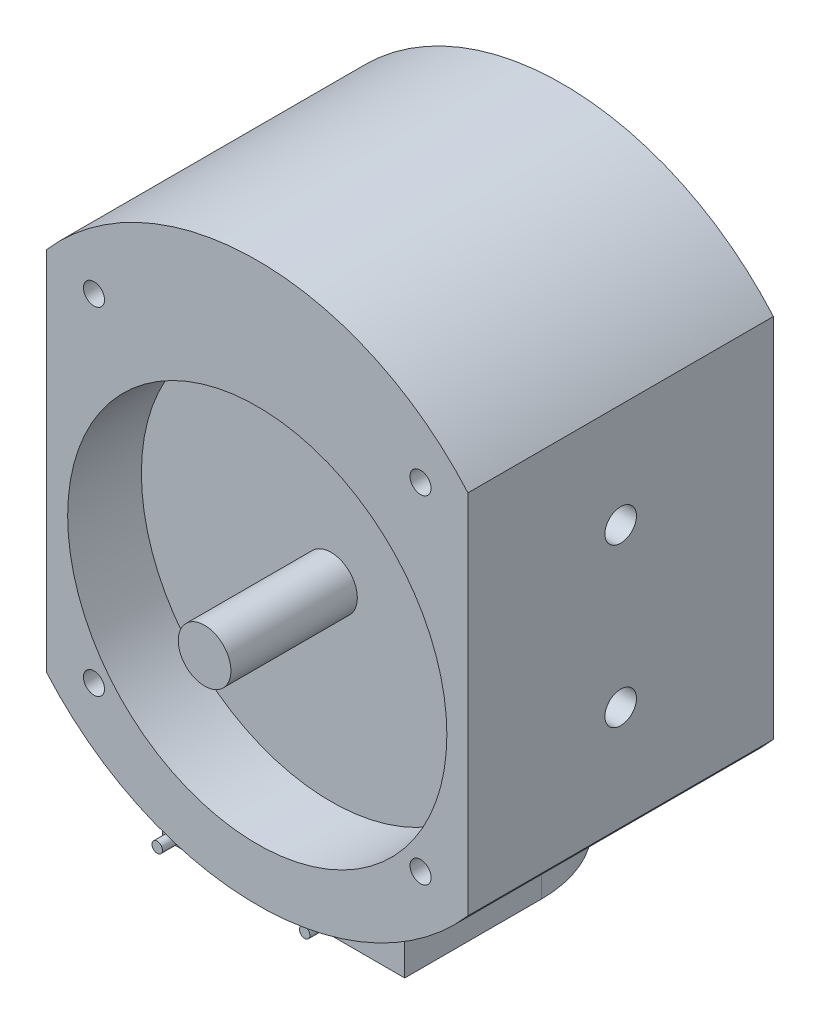
ISO-10303-21;
HEADER;
FILE_DESCRIPTION(('STEP AP214'),'2;1');
FILE_NAME('part.step','',(''),(''),'','','');
FILE_SCHEMA(('AUTOMOTIVE_DESIGN { 1 0 10303 214 1 1 1 1 }'));
ENDSEC;
DATA;
#1=APPLICATION_CONTEXT('core data for automotive mechanical design processes');
#2=APPLICATION_PROTOCOL_DEFINITION('international standard','automotive_design',2000,#1);
#3=PRODUCT_CONTEXT('',#1,'mechanical');
#4=PRODUCT('Part','Part','',(#3));
#5=PRODUCT_RELATED_PRODUCT_CATEGORY('part','',(#4));
#6=PRODUCT_DEFINITION_FORMATION('','',#4);
#7=PRODUCT_DEFINITION_CONTEXT('part definition',#1,'design');
#8=PRODUCT_DEFINITION('design','',#6,#7);
#9=PRODUCT_DEFINITION_SHAPE('','',#8);
#10=(LENGTH_UNIT() NAMED_UNIT(*) SI_UNIT(.MILLI.,.METRE.));
#11=(NAMED_UNIT(*) PLANE_ANGLE_UNIT() SI_UNIT($,.RADIAN.));
#12=(NAMED_UNIT(*) SI_UNIT($,.STERADIAN.) SOLID_ANGLE_UNIT());
#13=UNCERTAINTY_MEASURE_WITH_UNIT(LENGTH_MEASURE(1.E-05),#10,'distance_accuracy_value','');
#14=(GEOMETRIC_REPRESENTATION_CONTEXT(3) GLOBAL_UNCERTAINTY_ASSIGNED_CONTEXT((#13)) GLOBAL_UNIT_ASSIGNED_CONTEXT((#10,
#11,#12)) REPRESENTATION_CONTEXT('',''));
#15=CARTESIAN_POINT('',(0.,0.,0.));
#16=DIRECTION('',(0.,0.,1.));
#17=DIRECTION('',(1.,0.,0.));
#18=AXIS2_PLACEMENT_3D('',#15,#16,#17);
#19=CARTESIAN_POINT('',(0.,3.5,14.5));
#20=DIRECTION('',(0.,0.,-1.));
#21=DIRECTION('',(-1.,0.,0.));
#22=AXIS2_PLACEMENT_3D('',#19,#20,#21);
#23=CYLINDRICAL_SURFACE('',#22,26.5);
#24=CARTESIAN_POINT('',(-11.6589105316382,-20.2974747655136,-14.5));
#25=CARTESIAN_POINT('',(-11.9154676968057,-20.1718093041742,-14.2959001140857));
#26=CARTESIAN_POINT('',(-12.1630824303505,-20.0453255149593,-14.0810500499836));
#27=CARTESIAN_POINT('',(-12.6393824185313,-19.7930960766859,-13.6306854927107));
#28=CARTESIAN_POINT('',(-12.8680595138203,-19.6673507672593,-13.3951621814991));
#29=CARTESIAN_POINT('',(-13.3077324666989,-19.4176568230004,-12.9016408628952));
#30=CARTESIAN_POINT('',(-13.5184946313567,-19.2937455034853,-12.6434154580998));
#31=CARTESIAN_POINT('',(-13.9179940224215,-19.052027070936,-12.1077985291482));
#32=CARTESIAN_POINT('',(-14.106733705845,-18.9342192777571,-11.8304091485976));
#33=CARTESIAN_POINT('',(-14.4614925275649,-18.7072015210682,-11.2561339579276));
#34=CARTESIAN_POINT('',(-14.6274044286773,-18.5980330973372,-10.959165215517));
#35=CARTESIAN_POINT('',(-14.9337280022662,-18.3921868317732,-10.3481056723228));
#36=CARTESIAN_POINT('',(-15.0741359058972,-18.2955108366133,-10.0340123498616));
#37=CARTESIAN_POINT('',(-15.3265715966753,-18.1187377910747,-9.39271446062139));
#38=CARTESIAN_POINT('',(-15.4387875199959,-18.0385315263143,-9.06561465503932));
#39=CARTESIAN_POINT('',(-15.6340136706589,-17.8972464012562,-8.39901585498673));
#40=CARTESIAN_POINT('',(-15.7170436546997,-17.836154604983,-8.05952542054373));
#41=CARTESIAN_POINT('',(-15.8555328161024,-17.733464191094,-7.35398527624147));
#42=CARTESIAN_POINT('',(-15.9094185099119,-17.6929839471289,-6.98745376667842));
#43=CARTESIAN_POINT('',(-15.9636160456416,-17.6521491683226,-6.43290899781161));
#44=CARTESIAN_POINT('',(-15.977243832489,-17.6418512079414,-6.24680341666563));
#45=CARTESIAN_POINT('',(-15.9954402546632,-17.6280845885084,-5.87381509301593));
#46=CARTESIAN_POINT('',(-16.0000048207019,-17.6246189971213,-5.68693203915432));
#47=CARTESIAN_POINT('',(-16.,-17.6246301742776,-5.5));
#48=B_SPLINE_CURVE_WITH_KNOTS('',3,(#24,#25,#26,#27,#28,#29,#30,#31,#32,#33,#34,#35,#36,#37,#38,
#39,#40,#41,#42,#43,#44,#45,#46,#47),.UNSPECIFIED.,.F.,.F.,(4,2,2,2,2,2,2,2,2,2,2,4),(0.,
1.05303057629743,2.10651251923715,3.1721148381744,4.2375981554882,5.30792729946527,
6.37841448255864,7.44155585280831,8.50397616363341,9.61914308940885,10.1795044776233,
10.7401174051968),.UNSPECIFIED.);
#49=CARTESIAN_POINT('',(-11.6589105316382,-20.2974747655136,-14.5));
#50=VERTEX_POINT('',#49);
#51=CARTESIAN_POINT('',(-16.,-17.6246301742776,-5.5));
#52=VERTEX_POINT('',#51);
#53=EDGE_CURVE('E55',#50,#52,#48,.T.);
#54=ORIENTED_EDGE('',*,*,#53,.T.);
#55=DIRECTION('',(0.,0.,-1.));
#56=VECTOR('',#55,1.);
#57=CARTESIAN_POINT('',(-16.,-17.6246301742776,14.5));
#58=LINE('',#57,#56);
#59=CARTESIAN_POINT('',(-16.,-17.6246301742776,7.5));
#60=VERTEX_POINT('',#59);
#61=EDGE_CURVE('E59',#52,#60,#58,.F.);
#62=ORIENTED_EDGE('',*,*,#61,.T.);
#63=CARTESIAN_POINT('',(0.,3.5,7.5));
#64=DIRECTION('',(0.,0.,-1.));
#65=DIRECTION('',(-1.,0.,0.));
#66=AXIS2_PLACEMENT_3D('',#63,#64,#65);
#67=CIRCLE('',#66,26.5);
#68=CARTESIAN_POINT('',(7.,-22.0587558382641,7.5));
#69=VERTEX_POINT('',#68);
#70=EDGE_CURVE('E302',#60,#69,#67,.F.);
#71=ORIENTED_EDGE('',*,*,#70,.T.);
#72=DIRECTION('',(0.,0.,-1.));
#73=VECTOR('',#72,1.);
#74=CARTESIAN_POINT('',(7.,-22.0587558382641,14.5));
#75=LINE('',#74,#73);
#76=CARTESIAN_POINT('',(7.,-22.0587558382641,-5.5));
#77=VERTEX_POINT('',#76);
#78=EDGE_CURVE('E131',#69,#77,#75,.T.);
#79=ORIENTED_EDGE('',*,*,#78,.T.);
#80=CARTESIAN_POINT('',(7.,-22.0587558382641,-5.5));
#81=CARTESIAN_POINT('',(7.00004114539061,-22.0586982959201,-5.81855562818553));
#82=CARTESIAN_POINT('',(6.9867656500787,-22.0623791193772,-6.1370944323245));
#83=CARTESIAN_POINT('',(6.93388648216325,-22.0767980733885,-6.77175494429095));
#84=CARTESIAN_POINT('',(6.89428823810782,-22.0875347488071,-7.08787713690297));
#85=CARTESIAN_POINT('',(6.78917468691193,-22.1156179189392,-7.71482056973197));
#86=CARTESIAN_POINT('',(6.72371187861413,-22.1329510218861,-8.02565122562203));
#87=CARTESIAN_POINT('',(6.56742900996726,-22.1734381899362,-8.64047954285085));
#88=CARTESIAN_POINT('',(6.47660866814574,-22.1965923196534,-8.94447712830102));
#89=CARTESIAN_POINT('',(6.27033801334873,-22.2477013416021,-9.54353395824915));
#90=CARTESIAN_POINT('',(6.154890705678,-22.275655647972,-9.83859428837513));
#91=CARTESIAN_POINT('',(5.90021406441555,-22.3351421466902,-10.4178933349847));
#92=CARTESIAN_POINT('',(5.76098388630366,-22.3666744660788,-10.7021316667451));
#93=CARTESIAN_POINT('',(5.45972162719824,-22.4319333124048,-11.2579353289227));
#94=CARTESIAN_POINT('',(5.29769379265164,-22.4656594300827,-11.5295030069466));
#95=CARTESIAN_POINT('',(4.95195493451766,-22.5338088457176,-12.0582300635503));
#96=CARTESIAN_POINT('',(4.76824796286989,-22.5682320123994,-12.3153921214044));
#97=CARTESIAN_POINT('',(4.29491358302745,-22.6511753514429,-12.9233316042166));
#98=CARTESIAN_POINT('',(3.99418204469064,-22.6992527365189,-13.265667729756));
#99=CARTESIAN_POINT('',(3.51431437372429,-22.7664365608697,-13.7506090767723));
#100=CARTESIAN_POINT('',(3.34962448663423,-22.7880026119282,-13.9074470957732));
#101=CARTESIAN_POINT('',(3.01104568685911,-22.828932636612,-14.2112506292072));
#102=CARTESIAN_POINT('',(2.83715452285705,-22.8482960676281,-14.3582137073428));
#103=CARTESIAN_POINT('',(2.65891053163819,-22.866270020326,-14.5));
#104=B_SPLINE_CURVE_WITH_KNOTS('',3,(#80,#81,#82,#83,#84,#85,#86,#87,#88,#89,#90,#91,#92,#93,
#94,#95,#96,#97,#98,#99,#100,#101,#102,#103),.UNSPECIFIED.,.F.,.F.,(4,2,2,2,2,2,2,2,2,2,2,4),
(0.,0.955343151114599,1.91048934263225,2.86370669564004,3.81693462992461,4.77004630533584,
5.72319183239708,6.67616005452972,7.6289504433775,8.99985656948546,9.68484258606795,
10.3699969832328),.UNSPECIFIED.);
#105=CARTESIAN_POINT('',(2.65891053163817,-22.866270020326,-14.5));
#106=VERTEX_POINT('',#105);
#107=EDGE_CURVE('E129',#77,#106,#104,.T.);
#108=ORIENTED_EDGE('',*,*,#107,.T.);
#109=CARTESIAN_POINT('',(0.,3.5,-14.5));
#110=DIRECTION('',(0.,0.,1.));
#111=DIRECTION('',(1.,0.,0.));
#112=AXIS2_PLACEMENT_3D('',#109,#110,#111);
#113=CIRCLE('',#112,26.5);
#114=CARTESIAN_POINT('',(20.,-13.8853386507137,-14.5));
#115=VERTEX_POINT('',#114);
#116=EDGE_CURVE('E114',#106,#115,#113,.T.);
#117=ORIENTED_EDGE('',*,*,#116,.T.);
#118=DIRECTION('',(0.,0.,-1.));
#119=VECTOR('',#118,1.);
#120=CARTESIAN_POINT('',(20.,-13.8853386507137,14.5));
#121=LINE('',#120,#119);
#122=CARTESIAN_POINT('',(20.,-13.8853386507137,14.5));
#123=VERTEX_POINT('',#122);
#124=EDGE_CURVE('E227',#123,#115,#121,.T.);
#125=ORIENTED_EDGE('',*,*,#124,.F.);
#126=CARTESIAN_POINT('',(0.,3.5,14.5));
#127=DIRECTION('',(0.,0.,1.));
#128=DIRECTION('',(1.,0.,0.));
#129=AXIS2_PLACEMENT_3D('',#126,#127,#128);
#130=CIRCLE('',#129,26.5);
#131=CARTESIAN_POINT('',(-20.,-13.8853386507137,14.5));
#132=VERTEX_POINT('',#131);
#133=EDGE_CURVE('E226',#132,#123,#130,.T.);
#134=ORIENTED_EDGE('',*,*,#133,.F.);
#135=DIRECTION('',(0.,0.,-1.));
#136=VECTOR('',#135,1.);
#137=CARTESIAN_POINT('',(-20.,-13.8853386507137,14.5));
#138=LINE('',#137,#136);
#139=CARTESIAN_POINT('',(-20.,-13.8853386507137,-14.5));
#140=VERTEX_POINT('',#139);
#141=EDGE_CURVE('E218',#132,#140,#138,.T.);
#142=ORIENTED_EDGE('',*,*,#141,.T.);
#143=EDGE_CURVE('E125',#140,#50,#113,.T.);
#144=ORIENTED_EDGE('',*,*,#143,.T.);
#145=EDGE_LOOP('',(#54,#62,#71,#79,#108,#117,#125,#134,#142,#144));
#146=FACE_BOUND('',#145,.T.);
#147=ADVANCED_FACE('F38',(#146),#23,.T.);
#148=CARTESIAN_POINT('',(0.,3.5,14.5));
#149=DIRECTION('',(0.,0.,-1.));
#150=DIRECTION('',(-1.,0.,0.));
#151=AXIS2_PLACEMENT_3D('',#148,#149,#150);
#152=CYLINDRICAL_SURFACE('',#151,26.5);
#153=CARTESIAN_POINT('',(0.,3.5,-14.5));
#154=DIRECTION('',(0.,0.,1.));
#155=DIRECTION('',(1.,0.,0.));
#156=AXIS2_PLACEMENT_3D('',#153,#154,#155);
#157=CIRCLE('',#156,26.5);
#158=CARTESIAN_POINT('',(20.,20.8853386507137,-14.5));
#159=VERTEX_POINT('',#158);
#160=CARTESIAN_POINT('',(-20.,20.8853386507137,-14.5));
#161=VERTEX_POINT('',#160);
#162=EDGE_CURVE('E224',#159,#161,#157,.T.);
#163=ORIENTED_EDGE('',*,*,#162,.T.);
#164=DIRECTION('',(0.,0.,-1.));
#165=VECTOR('',#164,1.);
#166=CARTESIAN_POINT('',(-20.,20.8853386507137,14.5));
#167=LINE('',#166,#165);
#168=CARTESIAN_POINT('',(-20.,20.8853386507137,14.5));
#169=VERTEX_POINT('',#168);
#170=EDGE_CURVE('E221',#169,#161,#167,.T.);
#171=ORIENTED_EDGE('',*,*,#170,.F.);
#172=CARTESIAN_POINT('',(0.,3.5,14.5));
#173=DIRECTION('',(0.,0.,1.));
#174=DIRECTION('',(1.,0.,0.));
#175=AXIS2_PLACEMENT_3D('',#172,#173,#174);
#176=CIRCLE('',#175,26.5);
#177=CARTESIAN_POINT('',(20.,20.8853386507137,14.5));
#178=VERTEX_POINT('',#177);
#179=EDGE_CURVE('E230',#178,#169,#176,.T.);
#180=ORIENTED_EDGE('',*,*,#179,.F.);
#181=DIRECTION('',(0.,0.,-1.));
#182=VECTOR('',#181,1.);
#183=CARTESIAN_POINT('',(20.,20.8853386507137,14.5));
#184=LINE('',#183,#182);
#185=EDGE_CURVE('E234',#178,#159,#184,.T.);
#186=ORIENTED_EDGE('',*,*,#185,.T.);
#187=EDGE_LOOP('',(#163,#171,#180,#186));
#188=FACE_BOUND('',#187,.T.);
#189=ADVANCED_FACE('F40',(#188),#152,.T.);
#190=CARTESIAN_POINT('',(-20.,20.8853386507137,14.5));
#191=DIRECTION('',(1.,0.,0.));
#192=DIRECTION('',(0.,1.,0.));
#193=AXIS2_PLACEMENT_3D('',#190,#191,#192);
#194=PLANE('',#193);
#195=CARTESIAN_POINT('',(-20.,11.,0.));
#196=DIRECTION('',(1.,0.,0.));
#197=DIRECTION('',(0.,1.,0.));
#198=AXIS2_PLACEMENT_3D('',#195,#196,#197);
#199=CIRCLE('',#198,1.5);
#200=CARTESIAN_POINT('',(-20.,12.5,0.));
#201=VERTEX_POINT('',#200);
#202=EDGE_CURVE('E210',#201,#201,#199,.T.);
#203=ORIENTED_EDGE('',*,*,#202,.T.);
#204=EDGE_LOOP('',(#203));
#205=FACE_BOUND('',#204,.T.);
#206=CARTESIAN_POINT('',(-20.,-3.99999999999999,0.));
#207=DIRECTION('',(1.,0.,0.));
#208=DIRECTION('',(0.,1.,0.));
#209=AXIS2_PLACEMENT_3D('',#206,#207,#208);
#210=CIRCLE('',#209,1.5);
#211=CARTESIAN_POINT('',(-20.,-2.49999999999999,0.));
#212=VERTEX_POINT('',#211);
#213=EDGE_CURVE('E214',#212,#212,#210,.T.);
#214=ORIENTED_EDGE('',*,*,#213,.T.);
#215=EDGE_LOOP('',(#214));
#216=FACE_BOUND('',#215,.T.);
#217=DIRECTION('',(0.,-1.,0.));
#218=VECTOR('',#217,1.);
#219=CARTESIAN_POINT('',(-20.,20.8853386507137,-14.5));
#220=LINE('',#219,#218);
#221=EDGE_CURVE('E126',#161,#140,#220,.T.);
#222=ORIENTED_EDGE('',*,*,#221,.T.);
#223=ORIENTED_EDGE('',*,*,#141,.F.);
#224=DIRECTION('',(0.,-1.,0.));
#225=VECTOR('',#224,1.);
#226=CARTESIAN_POINT('',(-20.,20.8853386507137,14.5));
#227=LINE('',#226,#225);
#228=EDGE_CURVE('E308',#169,#132,#227,.T.);
#229=ORIENTED_EDGE('',*,*,#228,.F.);
#230=ORIENTED_EDGE('',*,*,#170,.T.);
#231=EDGE_LOOP('',(#222,#223,#229,#230));
#232=FACE_BOUND('',#231,.T.);
#233=ADVANCED_FACE('F195',(#205,#216,#232),#194,.F.);
#234=CARTESIAN_POINT('',(20.,20.8853386507137,14.5));
#235=DIRECTION('',(-1.,0.,0.));
#236=DIRECTION('',(0.,-1.,0.));
#237=AXIS2_PLACEMENT_3D('',#234,#235,#236);
#238=PLANE('',#237);
#239=CARTESIAN_POINT('',(20.,11.,0.));
#240=DIRECTION('',(1.,0.,0.));
#241=DIRECTION('',(0.,1.,0.));
#242=AXIS2_PLACEMENT_3D('',#239,#240,#241);
#243=CIRCLE('',#242,1.5);
#244=CARTESIAN_POINT('',(20.,12.5,0.));
#245=VERTEX_POINT('',#244);
#246=EDGE_CURVE('E443',#245,#245,#243,.T.);
#247=ORIENTED_EDGE('',*,*,#246,.F.);
#248=EDGE_LOOP('',(#247));
#249=FACE_BOUND('',#248,.T.);
#250=CARTESIAN_POINT('',(20.,-3.99999999999999,0.));
#251=DIRECTION('',(1.,0.,0.));
#252=DIRECTION('',(0.,1.,0.));
#253=AXIS2_PLACEMENT_3D('',#250,#251,#252);
#254=CIRCLE('',#253,1.5);
#255=CARTESIAN_POINT('',(20.,-2.49999999999999,0.));
#256=VERTEX_POINT('',#255);
#257=EDGE_CURVE('E428',#256,#256,#254,.T.);
#258=ORIENTED_EDGE('',*,*,#257,.F.);
#259=EDGE_LOOP('',(#258));
#260=FACE_BOUND('',#259,.T.);
#261=DIRECTION('',(0.,1.,0.));
#262=VECTOR('',#261,1.);
#263=CARTESIAN_POINT('',(20.,20.8853386507137,-14.5));
#264=LINE('',#263,#262);
#265=EDGE_CURVE('E122',#115,#159,#264,.T.);
#266=ORIENTED_EDGE('',*,*,#265,.T.);
#267=ORIENTED_EDGE('',*,*,#185,.F.);
#268=DIRECTION('',(0.,1.,0.));
#269=VECTOR('',#268,1.);
#270=CARTESIAN_POINT('',(20.,20.8853386507137,14.5));
#271=LINE('',#270,#269);
#272=EDGE_CURVE('E237',#123,#178,#271,.T.);
#273=ORIENTED_EDGE('',*,*,#272,.F.);
#274=ORIENTED_EDGE('',*,*,#124,.T.);
#275=EDGE_LOOP('',(#266,#267,#273,#274));
#276=FACE_BOUND('',#275,.T.);
#277=ADVANCED_FACE('F198',(#249,#260,#276),#238,.F.);
#278=CARTESIAN_POINT('',(0.,3.5,14.5));
#279=DIRECTION('',(0.,0.,1.));
#280=DIRECTION('',(1.,0.,0.));
#281=AXIS2_PLACEMENT_3D('',#278,#279,#280);
#282=PLANE('',#281);
#283=CARTESIAN_POINT('',(-15.5,-12.5,14.5));
#284=DIRECTION('',(0.,0.,1.));
#285=DIRECTION('',(-1.,0.,0.));
#286=AXIS2_PLACEMENT_3D('',#283,#284,#285);
#287=CIRCLE('',#286,1.);
#288=CARTESIAN_POINT('',(-16.5,-12.5,14.5));
#289=VERTEX_POINT('',#288);
#290=EDGE_CURVE('E442',#289,#289,#287,.T.);
#291=ORIENTED_EDGE('',*,*,#290,.F.);
#292=EDGE_LOOP('',(#291));
#293=FACE_BOUND('',#292,.T.);
#294=CARTESIAN_POINT('',(15.5,-12.5,14.5));
#295=DIRECTION('',(0.,0.,1.));
#296=DIRECTION('',(1.,0.,0.));
#297=AXIS2_PLACEMENT_3D('',#294,#295,#296);
#298=CIRCLE('',#297,1.);
#299=CARTESIAN_POINT('',(16.5,-12.5,14.5));
#300=VERTEX_POINT('',#299);
#301=EDGE_CURVE('E451',#300,#300,#298,.T.);
#302=ORIENTED_EDGE('',*,*,#301,.F.);
#303=EDGE_LOOP('',(#302));
#304=FACE_BOUND('',#303,.T.);
#305=CARTESIAN_POINT('',(15.5,19.5,14.5));
#306=DIRECTION('',(0.,0.,1.));
#307=DIRECTION('',(-1.,0.,0.));
#308=AXIS2_PLACEMENT_3D('',#305,#306,#307);
#309=CIRCLE('',#308,1.);
#310=CARTESIAN_POINT('',(14.5,19.5,14.5));
#311=VERTEX_POINT('',#310);
#312=EDGE_CURVE('E448',#311,#311,#309,.T.);
#313=ORIENTED_EDGE('',*,*,#312,.F.);
#314=EDGE_LOOP('',(#313));
#315=FACE_BOUND('',#314,.T.);
#316=CARTESIAN_POINT('',(-15.5,19.5,14.5));
#317=DIRECTION('',(0.,0.,1.));
#318=DIRECTION('',(1.,0.,0.));
#319=AXIS2_PLACEMENT_3D('',#316,#317,#318);
#320=CIRCLE('',#319,1.);
#321=CARTESIAN_POINT('',(-14.5,19.5,14.5));
#322=VERTEX_POINT('',#321);
#323=EDGE_CURVE('E249',#322,#322,#320,.T.);
#324=ORIENTED_EDGE('',*,*,#323,.F.);
#325=EDGE_LOOP('',(#324));
#326=FACE_BOUND('',#325,.T.);
#327=CARTESIAN_POINT('',(0.,0.,14.5));
#328=DIRECTION('',(0.,0.,1.));
#329=DIRECTION('',(1.,0.,0.));
#330=AXIS2_PLACEMENT_3D('',#327,#328,#329);
#331=CIRCLE('',#330,18.);
#332=CARTESIAN_POINT('',(18.,0.,14.5));
#333=VERTEX_POINT('',#332);
#334=EDGE_CURVE('E260',#333,#333,#331,.T.);
#335=ORIENTED_EDGE('',*,*,#334,.F.);
#336=EDGE_LOOP('',(#335));
#337=FACE_BOUND('',#336,.T.);
#338=ORIENTED_EDGE('',*,*,#179,.T.);
#339=ORIENTED_EDGE('',*,*,#228,.T.);
#340=ORIENTED_EDGE('',*,*,#133,.T.);
#341=ORIENTED_EDGE('',*,*,#272,.T.);
#342=EDGE_LOOP('',(#338,#339,#340,#341));
#343=FACE_BOUND('',#342,.T.);
#344=ADVANCED_FACE('F205',(#293,#304,#315,#326,#337,#343),#282,.T.);
#345=CARTESIAN_POINT('',(0.,3.5,-14.5));
#346=DIRECTION('',(0.,0.,1.));
#347=DIRECTION('',(1.,0.,0.));
#348=AXIS2_PLACEMENT_3D('',#345,#346,#347);
#349=PLANE('',#348);
#350=CARTESIAN_POINT('',(-15.5,-12.5,-14.5));
#351=DIRECTION('',(0.,0.,1.));
#352=DIRECTION('',(1.,0.,0.));
#353=AXIS2_PLACEMENT_3D('',#350,#351,#352);
#354=CIRCLE('',#353,1.);
#355=CARTESIAN_POINT('',(-14.5,-12.5,-14.5));
#356=VERTEX_POINT('',#355);
#357=EDGE_CURVE('E42',#356,#356,#354,.T.);
#358=ORIENTED_EDGE('',*,*,#357,.T.);
#359=EDGE_LOOP('',(#358));
#360=FACE_BOUND('',#359,.T.);
#361=CARTESIAN_POINT('',(15.5,-12.5,-14.5));
#362=DIRECTION('',(0.,0.,1.));
#363=DIRECTION('',(1.,0.,0.));
#364=AXIS2_PLACEMENT_3D('',#361,#362,#363);
#365=CIRCLE('',#364,1.);
#366=CARTESIAN_POINT('',(16.5,-12.5,-14.5));
#367=VERTEX_POINT('',#366);
#368=EDGE_CURVE('E251',#367,#367,#365,.T.);
#369=ORIENTED_EDGE('',*,*,#368,.T.);
#370=EDGE_LOOP('',(#369));
#371=FACE_BOUND('',#370,.T.);
#372=CARTESIAN_POINT('',(15.5,19.5,-14.5));
#373=DIRECTION('',(0.,0.,1.));
#374=DIRECTION('',(1.,0.,0.));
#375=AXIS2_PLACEMENT_3D('',#372,#373,#374);
#376=CIRCLE('',#375,1.);
#377=CARTESIAN_POINT('',(16.5,19.5,-14.5));
#378=VERTEX_POINT('',#377);
#379=EDGE_CURVE('E248',#378,#378,#376,.T.);
#380=ORIENTED_EDGE('',*,*,#379,.T.);
#381=EDGE_LOOP('',(#380));
#382=FACE_BOUND('',#381,.T.);
#383=CARTESIAN_POINT('',(-15.5,19.5,-14.5));
#384=DIRECTION('',(0.,0.,1.));
#385=DIRECTION('',(1.,0.,0.));
#386=AXIS2_PLACEMENT_3D('',#383,#384,#385);
#387=CIRCLE('',#386,1.);
#388=CARTESIAN_POINT('',(-14.5,19.5,-14.5));
#389=VERTEX_POINT('',#388);
#390=EDGE_CURVE('E245',#389,#389,#387,.T.);
#391=ORIENTED_EDGE('',*,*,#390,.T.);
#392=EDGE_LOOP('',(#391));
#393=FACE_BOUND('',#392,.T.);
#394=CARTESIAN_POINT('',(0.,0.,-14.5));
#395=DIRECTION('',(0.,0.,1.));
#396=DIRECTION('',(1.,0.,0.));
#397=AXIS2_PLACEMENT_3D('',#394,#395,#396);
#398=CIRCLE('',#397,2.5);
#399=CARTESIAN_POINT('',(2.5,0.,-14.5));
#400=VERTEX_POINT('',#399);
#401=EDGE_CURVE('E11',#400,#400,#398,.F.);
#402=ORIENTED_EDGE('',*,*,#401,.F.);
#403=EDGE_LOOP('',(#402));
#404=FACE_BOUND('',#403,.T.);
#405=ORIENTED_EDGE('',*,*,#162,.F.);
#406=ORIENTED_EDGE('',*,*,#265,.F.);
#407=ORIENTED_EDGE('',*,*,#116,.F.);
#408=DIRECTION('',(0.,-1.,0.));
#409=VECTOR('',#408,1.);
#410=CARTESIAN_POINT('',(2.65891053163817,30.002,-14.5));
#411=LINE('',#410,#409);
#412=CARTESIAN_POINT('',(2.65891053163817,-29.,-14.5));
#413=VERTEX_POINT('',#412);
#414=EDGE_CURVE('E120',#106,#413,#411,.T.);
#415=ORIENTED_EDGE('',*,*,#414,.T.);
#416=DIRECTION('',(-1.,0.,0.));
#417=VECTOR('',#416,1.);
#418=CARTESIAN_POINT('',(-11.6589105316382,-29.,-14.5));
#419=LINE('',#418,#417);
#420=CARTESIAN_POINT('',(-11.6589105316382,-29.,-14.5));
#421=VERTEX_POINT('',#420);
#422=EDGE_CURVE('E153',#413,#421,#419,.T.);
#423=ORIENTED_EDGE('',*,*,#422,.T.);
#424=DIRECTION('',(0.,-1.,0.));
#425=VECTOR('',#424,1.);
#426=CARTESIAN_POINT('',(-11.6589105316382,30.002,-14.5));
#427=LINE('',#426,#425);
#428=EDGE_CURVE('E139',#50,#421,#427,.T.);
#429=ORIENTED_EDGE('',*,*,#428,.F.);
#430=ORIENTED_EDGE('',*,*,#143,.F.);
#431=ORIENTED_EDGE('',*,*,#221,.F.);
#432=EDGE_LOOP('',(#405,#406,#407,#415,#423,#429,#430,#431));
#433=FACE_BOUND('',#432,.T.);
#434=ADVANCED_FACE('F117',(#360,#371,#382,#393,#404,#433),#349,.F.);
#435=CARTESIAN_POINT('',(-4.5,30.002,-5.5));
#436=DIRECTION('',(0.,-1.,0.));
#437=DIRECTION('',(0.,0.,-1.));
#438=AXIS2_PLACEMENT_3D('',#435,#436,#437);
#439=CYLINDRICAL_SURFACE('',#438,11.5);
#440=ORIENTED_EDGE('',*,*,#53,.F.);
#441=ORIENTED_EDGE('',*,*,#428,.T.);
#442=CARTESIAN_POINT('',(-4.5,-29.,-5.5));
#443=DIRECTION('',(0.,1.,0.));
#444=DIRECTION('',(0.,0.,1.));
#445=AXIS2_PLACEMENT_3D('',#442,#443,#444);
#446=CIRCLE('',#445,11.5);
#447=CARTESIAN_POINT('',(-16.,-29.,-5.5));
#448=VERTEX_POINT('',#447);
#449=EDGE_CURVE('E144',#421,#448,#446,.T.);
#450=ORIENTED_EDGE('',*,*,#449,.T.);
#451=DIRECTION('',(0.,-1.,0.));
#452=VECTOR('',#451,1.);
#453=CARTESIAN_POINT('',(-16.,30.002,-5.5));
#454=LINE('',#453,#452);
#455=EDGE_CURVE('E141',#52,#448,#454,.T.);
#456=ORIENTED_EDGE('',*,*,#455,.F.);
#457=EDGE_LOOP('',(#440,#441,#450,#456));
#458=FACE_BOUND('',#457,.T.);
#459=ADVANCED_FACE('F180',(#458),#439,.T.);
#460=CARTESIAN_POINT('',(-16.,30.002,-5.5));
#461=DIRECTION('',(1.,0.,0.));
#462=DIRECTION('',(0.,0.,-1.));
#463=AXIS2_PLACEMENT_3D('',#460,#461,#462);
#464=PLANE('',#463);
#465=ORIENTED_EDGE('',*,*,#61,.F.);
#466=ORIENTED_EDGE('',*,*,#455,.T.);
#467=DIRECTION('',(0.,0.,1.));
#468=VECTOR('',#467,1.);
#469=CARTESIAN_POINT('',(-16.,-29.,-5.5));
#470=LINE('',#469,#468);
#471=CARTESIAN_POINT('',(-16.,-29.,7.5));
#472=VERTEX_POINT('',#471);
#473=EDGE_CURVE('E291',#448,#472,#470,.T.);
#474=ORIENTED_EDGE('',*,*,#473,.T.);
#475=DIRECTION('',(0.,-1.,0.));
#476=VECTOR('',#475,1.);
#477=CARTESIAN_POINT('',(-16.,30.002,7.5));
#478=LINE('',#477,#476);
#479=EDGE_CURVE('E148',#60,#472,#478,.T.);
#480=ORIENTED_EDGE('',*,*,#479,.F.);
#481=EDGE_LOOP('',(#465,#466,#474,#480));
#482=FACE_BOUND('',#481,.T.);
#483=ADVANCED_FACE('F183',(#482),#464,.F.);
#484=CARTESIAN_POINT('',(-4.5,30.002,-5.5));
#485=DIRECTION('',(0.,-1.,0.));
#486=DIRECTION('',(0.,0.,-1.));
#487=AXIS2_PLACEMENT_3D('',#484,#485,#486);
#488=CYLINDRICAL_SURFACE('',#487,11.5);
#489=ORIENTED_EDGE('',*,*,#107,.F.);
#490=DIRECTION('',(0.,-1.,0.));
#491=VECTOR('',#490,1.);
#492=CARTESIAN_POINT('',(7.,30.002,-5.5));
#493=LINE('',#492,#491);
#494=CARTESIAN_POINT('',(7.,-29.,-5.5));
#495=VERTEX_POINT('',#494);
#496=EDGE_CURVE('E152',#77,#495,#493,.T.);
#497=ORIENTED_EDGE('',*,*,#496,.T.);
#498=CARTESIAN_POINT('',(-4.5,-29.,-5.5));
#499=DIRECTION('',(0.,1.,0.));
#500=DIRECTION('',(0.,0.,-1.));
#501=AXIS2_PLACEMENT_3D('',#498,#499,#500);
#502=CIRCLE('',#501,11.5);
#503=EDGE_CURVE('E138',#495,#413,#502,.T.);
#504=ORIENTED_EDGE('',*,*,#503,.T.);
#505=ORIENTED_EDGE('',*,*,#414,.F.);
#506=EDGE_LOOP('',(#489,#497,#504,#505));
#507=FACE_BOUND('',#506,.T.);
#508=ADVANCED_FACE('F136',(#507),#488,.T.);
#509=CARTESIAN_POINT('',(-4.5,-29.,-5.5));
#510=DIRECTION('',(0.,-1.,0.));
#511=DIRECTION('',(0.,0.,-1.));
#512=AXIS2_PLACEMENT_3D('',#509,#510,#511);
#513=PLANE('',#512);
#514=ORIENTED_EDGE('',*,*,#503,.F.);
#515=DIRECTION('',(0.,0.,-1.));
#516=VECTOR('',#515,1.);
#517=CARTESIAN_POINT('',(7.,-29.,-5.5));
#518=LINE('',#517,#516);
#519=CARTESIAN_POINT('',(7.,-29.,7.5));
#520=VERTEX_POINT('',#519);
#521=EDGE_CURVE('E285',#520,#495,#518,.T.);
#522=ORIENTED_EDGE('',*,*,#521,.F.);
#523=DIRECTION('',(1.,0.,0.));
#524=VECTOR('',#523,1.);
#525=CARTESIAN_POINT('',(7.,-29.,7.5));
#526=LINE('',#525,#524);
#527=EDGE_CURVE('E288',#472,#520,#526,.T.);
#528=ORIENTED_EDGE('',*,*,#527,.F.);
#529=ORIENTED_EDGE('',*,*,#473,.F.);
#530=ORIENTED_EDGE('',*,*,#449,.F.);
#531=ORIENTED_EDGE('',*,*,#422,.F.);
#532=EDGE_LOOP('',(#514,#522,#528,#529,#530,#531));
#533=FACE_BOUND('',#532,.T.);
#534=ADVANCED_FACE('F175',(#533),#513,.T.);
#535=CARTESIAN_POINT('',(7.,30.002,7.5));
#536=DIRECTION('',(0.,0.,-1.));
#537=DIRECTION('',(-1.,0.,0.));
#538=AXIS2_PLACEMENT_3D('',#535,#536,#537);
#539=PLANE('',#538);
#540=CARTESIAN_POINT('',(2.5,-25.,7.5));
#541=DIRECTION('',(0.,0.,-1.));
#542=DIRECTION('',(-1.,0.,0.));
#543=AXIS2_PLACEMENT_3D('',#540,#541,#542);
#544=CIRCLE('',#543,0.5);
#545=CARTESIAN_POINT('',(2.,-25.,7.5));
#546=VERTEX_POINT('',#545);
#547=EDGE_CURVE('E47',#546,#546,#544,.F.);
#548=ORIENTED_EDGE('',*,*,#547,.F.);
#549=EDGE_LOOP('',(#548));
#550=FACE_BOUND('',#549,.T.);
#551=CARTESIAN_POINT('',(-11.5,-25.,7.5));
#552=DIRECTION('',(0.,0.,-1.));
#553=DIRECTION('',(-1.,0.,0.));
#554=AXIS2_PLACEMENT_3D('',#551,#552,#553);
#555=CIRCLE('',#554,0.500000000000001);
#556=CARTESIAN_POINT('',(-12.,-25.,7.5));
#557=VERTEX_POINT('',#556);
#558=EDGE_CURVE('E240',#557,#557,#555,.F.);
#559=ORIENTED_EDGE('',*,*,#558,.F.);
#560=EDGE_LOOP('',(#559));
#561=FACE_BOUND('',#560,.T.);
#562=ORIENTED_EDGE('',*,*,#70,.F.);
#563=ORIENTED_EDGE('',*,*,#479,.T.);
#564=ORIENTED_EDGE('',*,*,#527,.T.);
#565=DIRECTION('',(0.,-1.,0.));
#566=VECTOR('',#565,1.);
#567=CARTESIAN_POINT('',(7.,30.002,7.5));
#568=LINE('',#567,#566);
#569=EDGE_CURVE('E150',#69,#520,#568,.T.);
#570=ORIENTED_EDGE('',*,*,#569,.F.);
#571=EDGE_LOOP('',(#562,#563,#564,#570));
#572=FACE_BOUND('',#571,.T.);
#573=ADVANCED_FACE('F178',(#550,#561,#572),#539,.F.);
#574=CARTESIAN_POINT('',(7.,30.002,-5.5));
#575=DIRECTION('',(-1.,0.,0.));
#576=DIRECTION('',(0.,0.,1.));
#577=AXIS2_PLACEMENT_3D('',#574,#575,#576);
#578=PLANE('',#577);
#579=ORIENTED_EDGE('',*,*,#78,.F.);
#580=ORIENTED_EDGE('',*,*,#569,.T.);
#581=ORIENTED_EDGE('',*,*,#521,.T.);
#582=ORIENTED_EDGE('',*,*,#496,.F.);
#583=EDGE_LOOP('',(#579,#580,#581,#582));
#584=FACE_BOUND('',#583,.T.);
#585=ADVANCED_FACE('F322',(#584),#578,.F.);
#586=CARTESIAN_POINT('',(-11.5,-25.,12.5));
#587=DIRECTION('',(0.,0.,-1.));
#588=DIRECTION('',(-1.,0.,0.));
#589=AXIS2_PLACEMENT_3D('',#586,#587,#588);
#590=CYLINDRICAL_SURFACE('',#589,0.500000000000001);
#591=CARTESIAN_POINT('',(-11.5,-25.,12.5));
#592=DIRECTION('',(0.,0.,1.));
#593=DIRECTION('',(1.,0.,0.));
#594=AXIS2_PLACEMENT_3D('',#591,#592,#593);
#595=CIRCLE('',#594,0.500000000000001);
#596=CARTESIAN_POINT('',(-11.,-25.,12.5));
#597=VERTEX_POINT('',#596);
#598=EDGE_CURVE('E281',#597,#597,#595,.T.);
#599=ORIENTED_EDGE('',*,*,#598,.F.);
#600=EDGE_LOOP('',(#599));
#601=FACE_BOUND('',#600,.T.);
#602=ORIENTED_EDGE('',*,*,#558,.T.);
#603=EDGE_LOOP('',(#602));
#604=FACE_BOUND('',#603,.T.);
#605=ADVANCED_FACE('F173',(#601,#604),#590,.T.);
#606=CARTESIAN_POINT('',(-11.5,-25.,12.5));
#607=DIRECTION('',(0.,0.,1.));
#608=DIRECTION('',(1.,0.,0.));
#609=AXIS2_PLACEMENT_3D('',#606,#607,#608);
#610=PLANE('',#609);
#611=ORIENTED_EDGE('',*,*,#598,.T.);
#612=EDGE_LOOP('',(#611));
#613=FACE_BOUND('',#612,.T.);
#614=ADVANCED_FACE('F337',(#613),#610,.T.);
#615=CARTESIAN_POINT('',(2.5,-25.,12.5));
#616=DIRECTION('',(0.,0.,-1.));
#617=DIRECTION('',(-1.,0.,0.));
#618=AXIS2_PLACEMENT_3D('',#615,#616,#617);
#619=CYLINDRICAL_SURFACE('',#618,0.5);
#620=CARTESIAN_POINT('',(2.5,-25.,12.5));
#621=DIRECTION('',(0.,0.,1.));
#622=DIRECTION('',(1.,0.,0.));
#623=AXIS2_PLACEMENT_3D('',#620,#621,#622);
#624=CIRCLE('',#623,0.5);
#625=CARTESIAN_POINT('',(3.,-25.,12.5));
#626=VERTEX_POINT('',#625);
#627=EDGE_CURVE('E276',#626,#626,#624,.T.);
#628=ORIENTED_EDGE('',*,*,#627,.F.);
#629=EDGE_LOOP('',(#628));
#630=FACE_BOUND('',#629,.T.);
#631=ORIENTED_EDGE('',*,*,#547,.T.);
#632=EDGE_LOOP('',(#631));
#633=FACE_BOUND('',#632,.T.);
#634=ADVANCED_FACE('F342',(#630,#633),#619,.T.);
#635=CARTESIAN_POINT('',(2.5,-25.,12.5));
#636=DIRECTION('',(0.,0.,1.));
#637=DIRECTION('',(1.,0.,0.));
#638=AXIS2_PLACEMENT_3D('',#635,#636,#637);
#639=PLANE('',#638);
#640=ORIENTED_EDGE('',*,*,#627,.T.);
#641=EDGE_LOOP('',(#640));
#642=FACE_BOUND('',#641,.T.);
#643=ADVANCED_FACE('F348',(#642),#639,.T.);
#644=CARTESIAN_POINT('',(0.,0.,-19.5));
#645=DIRECTION('',(0.,0.,1.));
#646=DIRECTION('',(1.,0.,0.));
#647=AXIS2_PLACEMENT_3D('',#644,#645,#646);
#648=PLANE('',#647);
#649=CARTESIAN_POINT('',(0.,0.,-19.5));
#650=DIRECTION('',(0.,0.,1.));
#651=DIRECTION('',(1.,0.,0.));
#652=AXIS2_PLACEMENT_3D('',#649,#650,#651);
#653=CIRCLE('',#652,2.5);
#654=CARTESIAN_POINT('',(2.5,0.,-19.5));
#655=VERTEX_POINT('',#654);
#656=EDGE_CURVE('E271',#655,#655,#653,.T.);
#657=ORIENTED_EDGE('',*,*,#656,.F.);
#658=EDGE_LOOP('',(#657));
#659=FACE_BOUND('',#658,.T.);
#660=ADVANCED_FACE('F354',(#659),#648,.F.);
#661=CARTESIAN_POINT('',(0.,0.,19.5));
#662=DIRECTION('',(0.,0.,-1.));
#663=DIRECTION('',(-1.,0.,0.));
#664=AXIS2_PLACEMENT_3D('',#661,#662,#663);
#665=CYLINDRICAL_SURFACE('',#664,2.5);
#666=ORIENTED_EDGE('',*,*,#656,.T.);
#667=EDGE_LOOP('',(#666));
#668=FACE_BOUND('',#667,.T.);
#669=ORIENTED_EDGE('',*,*,#401,.T.);
#670=EDGE_LOOP('',(#669));
#671=FACE_BOUND('',#670,.T.);
#672=ADVANCED_FACE('F362',(#668,#671),#665,.T.);
#673=CARTESIAN_POINT('',(0.,0.,7.5));
#674=DIRECTION('',(0.,0.,1.));
#675=DIRECTION('',(1.,0.,0.));
#676=AXIS2_PLACEMENT_3D('',#673,#674,#675);
#677=CYLINDRICAL_SURFACE('',#676,18.);
#678=CARTESIAN_POINT('',(0.,0.,7.5));
#679=DIRECTION('',(0.,0.,1.));
#680=DIRECTION('',(1.,0.,0.));
#681=AXIS2_PLACEMENT_3D('',#678,#679,#680);
#682=CIRCLE('',#681,18.);
#683=CARTESIAN_POINT('',(18.,0.,7.5));
#684=VERTEX_POINT('',#683);
#685=EDGE_CURVE('E265',#684,#684,#682,.T.);
#686=ORIENTED_EDGE('',*,*,#685,.F.);
#687=EDGE_LOOP('',(#686));
#688=FACE_BOUND('',#687,.T.);
#689=ORIENTED_EDGE('',*,*,#334,.T.);
#690=EDGE_LOOP('',(#689));
#691=FACE_BOUND('',#690,.T.);
#692=ADVANCED_FACE('F370',(#688,#691),#677,.F.);
#693=CARTESIAN_POINT('',(0.,0.,7.5));
#694=DIRECTION('',(0.,0.,1.));
#695=DIRECTION('',(1.,0.,0.));
#696=AXIS2_PLACEMENT_3D('',#693,#694,#695);
#697=PLANE('',#696);
#698=CARTESIAN_POINT('',(0.,0.,7.5));
#699=DIRECTION('',(0.,0.,1.));
#700=DIRECTION('',(1.,0.,0.));
#701=AXIS2_PLACEMENT_3D('',#698,#699,#700);
#702=CIRCLE('',#701,2.5);
#703=CARTESIAN_POINT('',(2.5,0.,7.5));
#704=VERTEX_POINT('',#703);
#705=EDGE_CURVE('E256',#704,#704,#702,.T.);
#706=ORIENTED_EDGE('',*,*,#705,.F.);
#707=EDGE_LOOP('',(#706));
#708=FACE_BOUND('',#707,.T.);
#709=ORIENTED_EDGE('',*,*,#685,.T.);
#710=EDGE_LOOP('',(#709));
#711=FACE_BOUND('',#710,.T.);
#712=ADVANCED_FACE('F368',(#708,#711),#697,.T.);
#713=CARTESIAN_POINT('',(0.,0.,19.5));
#714=DIRECTION('',(0.,0.,1.));
#715=DIRECTION('',(1.,0.,0.));
#716=AXIS2_PLACEMENT_3D('',#713,#714,#715);
#717=PLANE('',#716);
#718=CARTESIAN_POINT('',(0.,0.,19.5));
#719=DIRECTION('',(0.,0.,1.));
#720=DIRECTION('',(1.,0.,0.));
#721=AXIS2_PLACEMENT_3D('',#718,#719,#720);
#722=CIRCLE('',#721,2.5);
#723=CARTESIAN_POINT('',(2.5,0.,19.5));
#724=VERTEX_POINT('',#723);
#725=EDGE_CURVE('E273',#724,#724,#722,.T.);
#726=ORIENTED_EDGE('',*,*,#725,.T.);
#727=EDGE_LOOP('',(#726));
#728=FACE_BOUND('',#727,.T.);
#729=ADVANCED_FACE('F360',(#728),#717,.T.);
#730=ORIENTED_EDGE('',*,*,#725,.F.);
#731=EDGE_LOOP('',(#730));
#732=FACE_BOUND('',#731,.T.);
#733=ORIENTED_EDGE('',*,*,#705,.T.);
#734=EDGE_LOOP('',(#733));
#735=FACE_BOUND('',#734,.T.);
#736=ADVANCED_FACE('F356',(#732,#735),#665,.T.);
#737=CARTESIAN_POINT('',(-15.5,19.5,-19.5));
#738=DIRECTION('',(0.,0.,1.));
#739=DIRECTION('',(1.,0.,0.));
#740=AXIS2_PLACEMENT_3D('',#737,#738,#739);
#741=CYLINDRICAL_SURFACE('',#740,1.);
#742=ORIENTED_EDGE('',*,*,#323,.T.);
#743=EDGE_LOOP('',(#742));
#744=FACE_BOUND('',#743,.T.);
#745=ORIENTED_EDGE('',*,*,#390,.F.);
#746=EDGE_LOOP('',(#745));
#747=FACE_BOUND('',#746,.T.);
#748=ADVANCED_FACE('F359',(#744,#747),#741,.F.);
#749=CARTESIAN_POINT('',(15.5,19.5,-19.5));
#750=DIRECTION('',(0.,0.,1.));
#751=DIRECTION('',(1.,0.,0.));
#752=AXIS2_PLACEMENT_3D('',#749,#750,#751);
#753=CYLINDRICAL_SURFACE('',#752,1.);
#754=ORIENTED_EDGE('',*,*,#312,.T.);
#755=EDGE_LOOP('',(#754));
#756=FACE_BOUND('',#755,.T.);
#757=ORIENTED_EDGE('',*,*,#379,.F.);
#758=EDGE_LOOP('',(#757));
#759=FACE_BOUND('',#758,.T.);
#760=ADVANCED_FACE('F379',(#756,#759),#753,.F.);
#761=CARTESIAN_POINT('',(15.5,-12.5,-19.5));
#762=DIRECTION('',(0.,0.,1.));
#763=DIRECTION('',(1.,0.,0.));
#764=AXIS2_PLACEMENT_3D('',#761,#762,#763);
#765=CYLINDRICAL_SURFACE('',#764,1.);
#766=ORIENTED_EDGE('',*,*,#301,.T.);
#767=EDGE_LOOP('',(#766));
#768=FACE_BOUND('',#767,.T.);
#769=ORIENTED_EDGE('',*,*,#368,.F.);
#770=EDGE_LOOP('',(#769));
#771=FACE_BOUND('',#770,.T.);
#772=ADVANCED_FACE('F385',(#768,#771),#765,.F.);
#773=CARTESIAN_POINT('',(-15.5,-12.5,-19.5));
#774=DIRECTION('',(0.,0.,1.));
#775=DIRECTION('',(1.,0.,0.));
#776=AXIS2_PLACEMENT_3D('',#773,#774,#775);
#777=CYLINDRICAL_SURFACE('',#776,1.);
#778=ORIENTED_EDGE('',*,*,#290,.T.);
#779=EDGE_LOOP('',(#778));
#780=FACE_BOUND('',#779,.T.);
#781=ORIENTED_EDGE('',*,*,#357,.F.);
#782=EDGE_LOOP('',(#781));
#783=FACE_BOUND('',#782,.T.);
#784=ADVANCED_FACE('F381',(#780,#783),#777,.F.);
#785=CARTESIAN_POINT('',(15.,-4.,0.));
#786=DIRECTION('',(1.,0.,0.));
#787=DIRECTION('',(0.,1.,0.));
#788=AXIS2_PLACEMENT_3D('',#785,#786,#787);
#789=CYLINDRICAL_SURFACE('',#788,1.5);
#790=CARTESIAN_POINT('',(15.,-4.,0.));
#791=DIRECTION('',(1.,0.,0.));
#792=DIRECTION('',(0.,1.,0.));
#793=AXIS2_PLACEMENT_3D('',#790,#791,#792);
#794=CIRCLE('',#793,1.5);
#795=CARTESIAN_POINT('',(15.,-2.5,0.));
#796=VERTEX_POINT('',#795);
#797=EDGE_CURVE('E431',#796,#796,#794,.T.);
#798=ORIENTED_EDGE('',*,*,#797,.F.);
#799=EDGE_LOOP('',(#798));
#800=FACE_BOUND('',#799,.T.);
#801=ORIENTED_EDGE('',*,*,#257,.T.);
#802=EDGE_LOOP('',(#801));
#803=FACE_BOUND('',#802,.T.);
#804=ADVANCED_FACE('F384',(#800,#803),#789,.F.);
#805=CARTESIAN_POINT('',(15.,-4.,0.));
#806=DIRECTION('',(1.,0.,0.));
#807=DIRECTION('',(0.,1.,0.));
#808=AXIS2_PLACEMENT_3D('',#805,#806,#807);
#809=PLANE('',#808);
#810=ORIENTED_EDGE('',*,*,#797,.T.);
#811=EDGE_LOOP('',(#810));
#812=FACE_BOUND('',#811,.T.);
#813=ADVANCED_FACE('F395',(#812),#809,.T.);
#814=CARTESIAN_POINT('',(15.,11.,0.));
#815=DIRECTION('',(1.,0.,0.));
#816=DIRECTION('',(0.,1.,0.));
#817=AXIS2_PLACEMENT_3D('',#814,#815,#816);
#818=CYLINDRICAL_SURFACE('',#817,1.5);
#819=CARTESIAN_POINT('',(15.,11.,0.));
#820=DIRECTION('',(1.,0.,0.));
#821=DIRECTION('',(0.,1.,0.));
#822=AXIS2_PLACEMENT_3D('',#819,#820,#821);
#823=CIRCLE('',#822,1.5);
#824=CARTESIAN_POINT('',(15.,12.5,0.));
#825=VERTEX_POINT('',#824);
#826=EDGE_CURVE('E439',#825,#825,#823,.T.);
#827=ORIENTED_EDGE('',*,*,#826,.F.);
#828=EDGE_LOOP('',(#827));
#829=FACE_BOUND('',#828,.T.);
#830=ORIENTED_EDGE('',*,*,#246,.T.);
#831=EDGE_LOOP('',(#830));
#832=FACE_BOUND('',#831,.T.);
#833=ADVANCED_FACE('F399',(#829,#832),#818,.F.);
#834=CARTESIAN_POINT('',(15.,11.,0.));
#835=DIRECTION('',(1.,0.,0.));
#836=DIRECTION('',(0.,1.,0.));
#837=AXIS2_PLACEMENT_3D('',#834,#835,#836);
#838=PLANE('',#837);
#839=ORIENTED_EDGE('',*,*,#826,.T.);
#840=EDGE_LOOP('',(#839));
#841=FACE_BOUND('',#840,.T.);
#842=ADVANCED_FACE('F403',(#841),#838,.T.);
#843=CARTESIAN_POINT('',(-15.,-4.,0.));
#844=DIRECTION('',(-1.,0.,0.));
#845=DIRECTION('',(0.,-1.,0.));
#846=AXIS2_PLACEMENT_3D('',#843,#844,#845);
#847=CYLINDRICAL_SURFACE('',#846,1.5);
#848=CARTESIAN_POINT('',(-15.,-4.,0.));
#849=DIRECTION('',(1.,0.,0.));
#850=DIRECTION('',(0.,1.,0.));
#851=AXIS2_PLACEMENT_3D('',#848,#849,#850);
#852=CIRCLE('',#851,1.5);
#853=CARTESIAN_POINT('',(-15.,-2.5,0.));
#854=VERTEX_POINT('',#853);
#855=EDGE_CURVE('E433',#854,#854,#852,.T.);
#856=ORIENTED_EDGE('',*,*,#855,.T.);
#857=EDGE_LOOP('',(#856));
#858=FACE_BOUND('',#857,.T.);
#859=ORIENTED_EDGE('',*,*,#213,.F.);
#860=EDGE_LOOP('',(#859));
#861=FACE_BOUND('',#860,.T.);
#862=ADVANCED_FACE('F407',(#858,#861),#847,.F.);
#863=CARTESIAN_POINT('',(-15.,-4.,0.));
#864=DIRECTION('',(-1.,0.,0.));
#865=DIRECTION('',(0.,1.,0.));
#866=AXIS2_PLACEMENT_3D('',#863,#864,#865);
#867=PLANE('',#866);
#868=ORIENTED_EDGE('',*,*,#855,.F.);
#869=EDGE_LOOP('',(#868));
#870=FACE_BOUND('',#869,.T.);
#871=ADVANCED_FACE('F411',(#870),#867,.T.);
#872=CARTESIAN_POINT('',(-15.,11.,0.));
#873=DIRECTION('',(-1.,0.,0.));
#874=DIRECTION('',(0.,-1.,0.));
#875=AXIS2_PLACEMENT_3D('',#872,#873,#874);
#876=CYLINDRICAL_SURFACE('',#875,1.5);
#877=CARTESIAN_POINT('',(-15.,11.,0.));
#878=DIRECTION('',(1.,0.,0.));
#879=DIRECTION('',(0.,1.,0.));
#880=AXIS2_PLACEMENT_3D('',#877,#878,#879);
#881=CIRCLE('',#880,1.5);
#882=CARTESIAN_POINT('',(-15.,12.5,0.));
#883=VERTEX_POINT('',#882);
#884=EDGE_CURVE('E427',#883,#883,#881,.T.);
#885=ORIENTED_EDGE('',*,*,#884,.T.);
#886=EDGE_LOOP('',(#885));
#887=FACE_BOUND('',#886,.T.);
#888=ORIENTED_EDGE('',*,*,#202,.F.);
#889=EDGE_LOOP('',(#888));
#890=FACE_BOUND('',#889,.T.);
#891=ADVANCED_FACE('F415',(#887,#890),#876,.F.);
#892=CARTESIAN_POINT('',(-15.,11.,0.));
#893=DIRECTION('',(-1.,0.,0.));
#894=DIRECTION('',(0.,1.,0.));
#895=AXIS2_PLACEMENT_3D('',#892,#893,#894);
#896=PLANE('',#895);
#897=ORIENTED_EDGE('',*,*,#884,.F.);
#898=EDGE_LOOP('',(#897));
#899=FACE_BOUND('',#898,.T.);
#900=ADVANCED_FACE('F419',(#899),#896,.T.);
#901=CLOSED_SHELL('',(#147,#189,#233,#277,#344,#434,#459,#483,#508,#534,#573,#585,#605,#614,
#634,#643,#660,#672,#692,#712,#729,#736,#748,#760,#772,#784,#804,#813,#833,#842,#862,#871,#891,#900));
#902=MANIFOLD_SOLID_BREP('B2',#901);
#903=ADVANCED_BREP_SHAPE_REPRESENTATION('',(#18,#902),#14);
#904=SHAPE_DEFINITION_REPRESENTATION(#9,#903);
ENDSEC;
END-ISO-10303-21;
